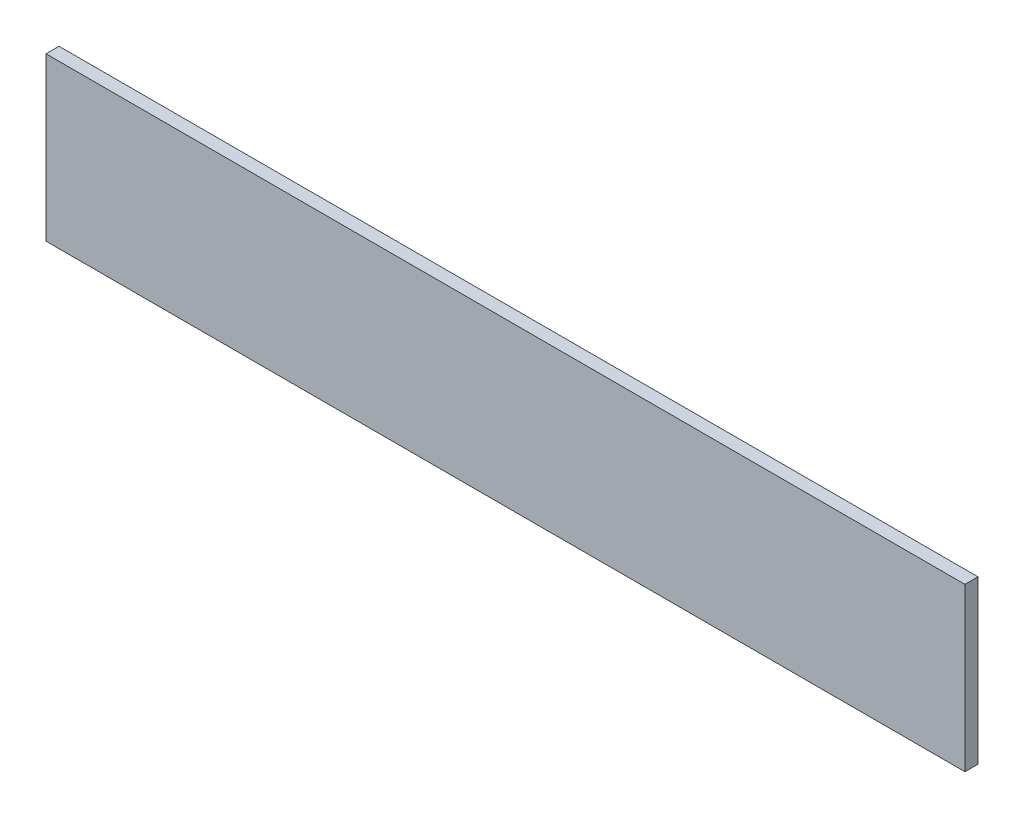
ISO-10303-21;
HEADER;
FILE_DESCRIPTION(('STEP AP214'),'2;1');
FILE_NAME('part.step','',(''),(''),'','','');
FILE_SCHEMA(('AUTOMOTIVE_DESIGN { 1 0 10303 214 1 1 1 1 }'));
ENDSEC;
DATA;
#1=APPLICATION_CONTEXT('core data for automotive mechanical design processes');
#2=APPLICATION_PROTOCOL_DEFINITION('international standard','automotive_design',2000,#1);
#3=PRODUCT_CONTEXT('',#1,'mechanical');
#4=PRODUCT('Part','Part','',(#3));
#5=PRODUCT_RELATED_PRODUCT_CATEGORY('part','',(#4));
#6=PRODUCT_DEFINITION_FORMATION('','',#4);
#7=PRODUCT_DEFINITION_CONTEXT('part definition',#1,'design');
#8=PRODUCT_DEFINITION('design','',#6,#7);
#9=PRODUCT_DEFINITION_SHAPE('','',#8);
#10=(LENGTH_UNIT() NAMED_UNIT(*) SI_UNIT(.MILLI.,.METRE.));
#11=(NAMED_UNIT(*) PLANE_ANGLE_UNIT() SI_UNIT($,.RADIAN.));
#12=(NAMED_UNIT(*) SI_UNIT($,.STERADIAN.) SOLID_ANGLE_UNIT());
#13=UNCERTAINTY_MEASURE_WITH_UNIT(LENGTH_MEASURE(1.E-05),#10,'distance_accuracy_value','');
#14=(GEOMETRIC_REPRESENTATION_CONTEXT(3) GLOBAL_UNCERTAINTY_ASSIGNED_CONTEXT((#13)) GLOBAL_UNIT_ASSIGNED_CONTEXT((#10,
#11,#12)) REPRESENTATION_CONTEXT('',''));
#15=CARTESIAN_POINT('',(0.,0.,0.));
#16=DIRECTION('',(0.,0.,1.));
#17=DIRECTION('',(1.,0.,0.));
#18=AXIS2_PLACEMENT_3D('',#15,#16,#17);
#19=CARTESIAN_POINT('',(0.,0.,1.00000000000006));
#20=DIRECTION('',(0.,0.,1.));
#21=DIRECTION('',(1.,0.,0.));
#22=AXIS2_PLACEMENT_3D('',#19,#20,#21);
#23=PLANE('',#22);
#24=DIRECTION('',(0.,1.,0.));
#25=VECTOR('',#24,1.);
#26=CARTESIAN_POINT('',(-35.227000000012,6.2209999999995,1.00000000000006));
#27=LINE('',#26,#25);
#28=CARTESIAN_POINT('',(-35.227000000012,-6.2209999999995,1.00000000000006));
#29=VERTEX_POINT('',#28);
#30=CARTESIAN_POINT('',(-35.227000000012,6.2209999999995,1.00000000000006));
#31=VERTEX_POINT('',#30);
#32=EDGE_CURVE('E68',#29,#31,#27,.T.);
#33=ORIENTED_EDGE('',*,*,#32,.F.);
#34=DIRECTION('',(1.,0.,0.));
#35=VECTOR('',#34,1.);
#36=CARTESIAN_POINT('',(-35.227000000012,-6.2209999999995,1.00000000000006));
#37=LINE('',#36,#35);
#38=CARTESIAN_POINT('',(35.227000000012,-6.2209999999995,1.00000000000006));
#39=VERTEX_POINT('',#38);
#40=EDGE_CURVE('E20',#39,#29,#37,.F.);
#41=ORIENTED_EDGE('',*,*,#40,.F.);
#42=DIRECTION('',(0.,1.,0.));
#43=VECTOR('',#42,1.);
#44=CARTESIAN_POINT('',(35.227000000012,-6.2209999999995,1.00000000000006));
#45=LINE('',#44,#43);
#46=CARTESIAN_POINT('',(35.227000000012,6.2209999999995,1.00000000000006));
#47=VERTEX_POINT('',#46);
#48=EDGE_CURVE('E58',#47,#39,#45,.F.);
#49=ORIENTED_EDGE('',*,*,#48,.F.);
#50=DIRECTION('',(1.,0.,0.));
#51=VECTOR('',#50,1.);
#52=CARTESIAN_POINT('',(35.227000000012,6.2209999999995,1.00000000000006));
#53=LINE('',#52,#51);
#54=EDGE_CURVE('E53',#31,#47,#53,.T.);
#55=ORIENTED_EDGE('',*,*,#54,.F.);
#56=EDGE_LOOP('',(#33,#41,#49,#55));
#57=FACE_BOUND('',#56,.T.);
#58=ADVANCED_FACE('F17',(#57),#23,.T.);
#59=CARTESIAN_POINT('',(-35.227000000012,-6.2209999999995,0.));
#60=DIRECTION('',(0.,-1.,0.));
#61=DIRECTION('',(0.,0.,-1.));
#62=AXIS2_PLACEMENT_3D('',#59,#60,#61);
#63=PLANE('',#62);
#64=DIRECTION('',(0.,0.,1.));
#65=VECTOR('',#64,1.);
#66=CARTESIAN_POINT('',(-35.227000000012,-6.2209999999995,0.));
#67=LINE('',#66,#65);
#68=CARTESIAN_POINT('',(-35.227000000012,-6.2209999999995,0.));
#69=VERTEX_POINT('',#68);
#70=EDGE_CURVE('E79',#69,#29,#67,.T.);
#71=ORIENTED_EDGE('',*,*,#70,.F.);
#72=DIRECTION('',(1.,0.,0.));
#73=VECTOR('',#72,1.);
#74=CARTESIAN_POINT('',(0.,-6.2209999999995,0.));
#75=LINE('',#74,#73);
#76=CARTESIAN_POINT('',(35.227000000012,-6.2209999999995,0.));
#77=VERTEX_POINT('',#76);
#78=EDGE_CURVE('E74',#69,#77,#75,.T.);
#79=ORIENTED_EDGE('',*,*,#78,.T.);
#80=DIRECTION('',(0.,0.,-1.));
#81=VECTOR('',#80,1.);
#82=CARTESIAN_POINT('',(35.227000000012,-6.2209999999995,0.));
#83=LINE('',#82,#81);
#84=EDGE_CURVE('E63',#39,#77,#83,.T.);
#85=ORIENTED_EDGE('',*,*,#84,.F.);
#86=ORIENTED_EDGE('',*,*,#40,.T.);
#87=EDGE_LOOP('',(#71,#79,#85,#86));
#88=FACE_BOUND('',#87,.T.);
#89=ADVANCED_FACE('F73',(#88),#63,.T.);
#90=CARTESIAN_POINT('',(35.227000000012,-6.2209999999995,0.));
#91=DIRECTION('',(1.,0.,0.));
#92=DIRECTION('',(0.,0.,-1.));
#93=AXIS2_PLACEMENT_3D('',#90,#91,#92);
#94=PLANE('',#93);
#95=ORIENTED_EDGE('',*,*,#84,.T.);
#96=DIRECTION('',(0.,1.,0.));
#97=VECTOR('',#96,1.);
#98=CARTESIAN_POINT('',(35.227000000012,0.,0.));
#99=LINE('',#98,#97);
#100=CARTESIAN_POINT('',(35.227000000012,6.2209999999995,0.));
#101=VERTEX_POINT('',#100);
#102=EDGE_CURVE('E84',#77,#101,#99,.T.);
#103=ORIENTED_EDGE('',*,*,#102,.T.);
#104=DIRECTION('',(0.,0.,1.));
#105=VECTOR('',#104,1.);
#106=CARTESIAN_POINT('',(35.227000000012,6.2209999999995,0.));
#107=LINE('',#106,#105);
#108=EDGE_CURVE('E65',#47,#101,#107,.F.);
#109=ORIENTED_EDGE('',*,*,#108,.F.);
#110=ORIENTED_EDGE('',*,*,#48,.T.);
#111=EDGE_LOOP('',(#95,#103,#109,#110));
#112=FACE_BOUND('',#111,.T.);
#113=ADVANCED_FACE('F60',(#112),#94,.T.);
#114=CARTESIAN_POINT('',(35.227000000012,6.2209999999995,0.));
#115=DIRECTION('',(0.,1.,0.));
#116=DIRECTION('',(0.,0.,1.));
#117=AXIS2_PLACEMENT_3D('',#114,#115,#116);
#118=PLANE('',#117);
#119=ORIENTED_EDGE('',*,*,#108,.T.);
#120=DIRECTION('',(1.,0.,0.));
#121=VECTOR('',#120,1.);
#122=CARTESIAN_POINT('',(0.,6.2209999999995,0.));
#123=LINE('',#122,#121);
#124=CARTESIAN_POINT('',(-35.227000000012,6.2209999999995,0.));
#125=VERTEX_POINT('',#124);
#126=EDGE_CURVE('E26',#101,#125,#123,.F.);
#127=ORIENTED_EDGE('',*,*,#126,.T.);
#128=DIRECTION('',(0.,0.,1.));
#129=VECTOR('',#128,1.);
#130=CARTESIAN_POINT('',(-35.227000000012,6.2209999999995,0.));
#131=LINE('',#130,#129);
#132=EDGE_CURVE('E34',#31,#125,#131,.F.);
#133=ORIENTED_EDGE('',*,*,#132,.F.);
#134=ORIENTED_EDGE('',*,*,#54,.T.);
#135=EDGE_LOOP('',(#119,#127,#133,#134));
#136=FACE_BOUND('',#135,.T.);
#137=ADVANCED_FACE('F88',(#136),#118,.T.);
#138=CARTESIAN_POINT('',(-35.227000000012,6.2209999999995,0.));
#139=DIRECTION('',(-1.,0.,0.));
#140=DIRECTION('',(0.,0.,1.));
#141=AXIS2_PLACEMENT_3D('',#138,#139,#140);
#142=PLANE('',#141);
#143=ORIENTED_EDGE('',*,*,#132,.T.);
#144=DIRECTION('',(0.,1.,0.));
#145=VECTOR('',#144,1.);
#146=CARTESIAN_POINT('',(-35.227000000012,0.,0.));
#147=LINE('',#146,#145);
#148=EDGE_CURVE('E11',#125,#69,#147,.F.);
#149=ORIENTED_EDGE('',*,*,#148,.T.);
#150=ORIENTED_EDGE('',*,*,#70,.T.);
#151=ORIENTED_EDGE('',*,*,#32,.T.);
#152=EDGE_LOOP('',(#143,#149,#150,#151));
#153=FACE_BOUND('',#152,.T.);
#154=ADVANCED_FACE('F91',(#153),#142,.T.);
#155=CARTESIAN_POINT('',(0.,0.,0.));
#156=DIRECTION('',(0.,0.,1.));
#157=DIRECTION('',(1.,0.,0.));
#158=AXIS2_PLACEMENT_3D('',#155,#156,#157);
#159=PLANE('',#158);
#160=ORIENTED_EDGE('',*,*,#126,.F.);
#161=ORIENTED_EDGE('',*,*,#102,.F.);
#162=ORIENTED_EDGE('',*,*,#78,.F.);
#163=ORIENTED_EDGE('',*,*,#148,.F.);
#164=EDGE_LOOP('',(#160,#161,#162,#163));
#165=FACE_BOUND('',#164,.T.);
#166=ADVANCED_FACE('F90',(#165),#159,.F.);
#167=CLOSED_SHELL('',(#58,#89,#113,#137,#154,#166));
#168=MANIFOLD_SOLID_BREP('B1',#167);
#169=ADVANCED_BREP_SHAPE_REPRESENTATION('',(#18,#168),#14);
#170=SHAPE_DEFINITION_REPRESENTATION(#9,#169);
ENDSEC;
END-ISO-10303-21;
